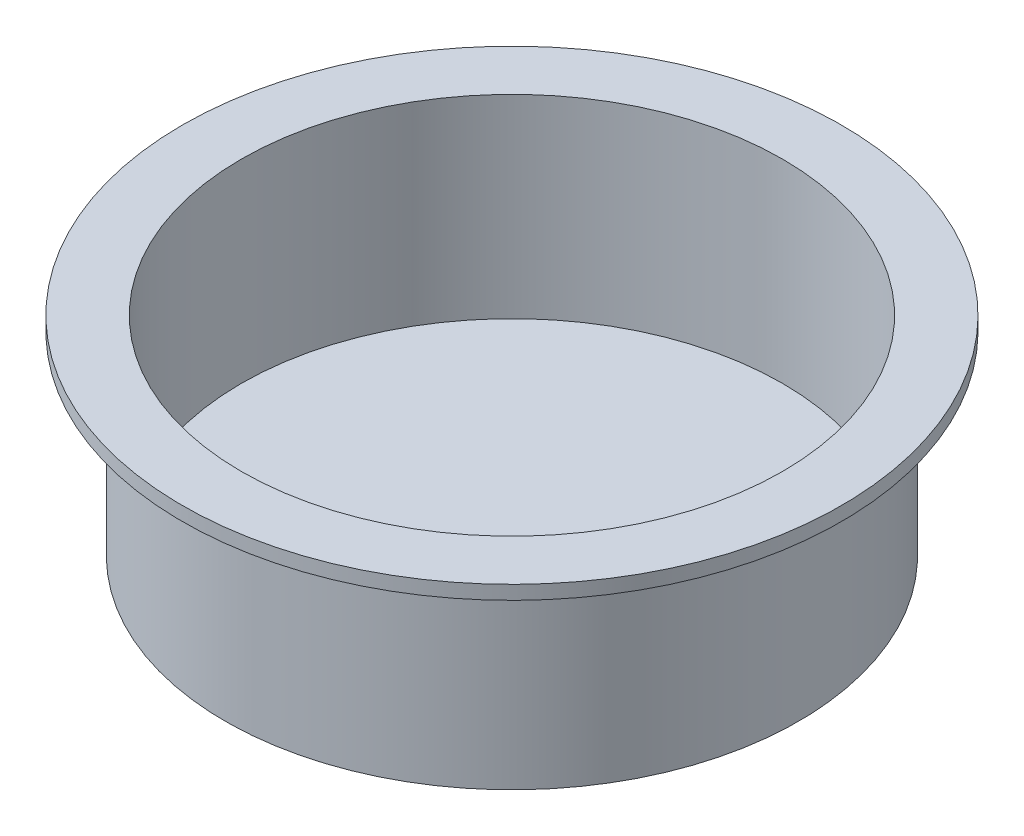
ISO-10303-21;
HEADER;
FILE_DESCRIPTION(('STEP AP214'),'2;1');
FILE_NAME('part.step','',(''),(''),'','','');
FILE_SCHEMA(('AUTOMOTIVE_DESIGN { 1 0 10303 214 1 1 1 1 }'));
ENDSEC;
DATA;
#1=APPLICATION_CONTEXT('core data for automotive mechanical design processes');
#2=APPLICATION_PROTOCOL_DEFINITION('international standard','automotive_design',2000,#1);
#3=PRODUCT_CONTEXT('',#1,'mechanical');
#4=PRODUCT('Part','Part','',(#3));
#5=PRODUCT_RELATED_PRODUCT_CATEGORY('part','',(#4));
#6=PRODUCT_DEFINITION_FORMATION('','',#4);
#7=PRODUCT_DEFINITION_CONTEXT('part definition',#1,'design');
#8=PRODUCT_DEFINITION('design','',#6,#7);
#9=PRODUCT_DEFINITION_SHAPE('','',#8);
#10=(LENGTH_UNIT() NAMED_UNIT(*) SI_UNIT(.MILLI.,.METRE.));
#11=(NAMED_UNIT(*) PLANE_ANGLE_UNIT() SI_UNIT($,.RADIAN.));
#12=(NAMED_UNIT(*) SI_UNIT($,.STERADIAN.) SOLID_ANGLE_UNIT());
#13=UNCERTAINTY_MEASURE_WITH_UNIT(LENGTH_MEASURE(1.E-05),#10,'distance_accuracy_value','');
#14=(GEOMETRIC_REPRESENTATION_CONTEXT(3) GLOBAL_UNCERTAINTY_ASSIGNED_CONTEXT((#13)) GLOBAL_UNIT_ASSIGNED_CONTEXT((#10,
#11,#12)) REPRESENTATION_CONTEXT('',''));
#15=CARTESIAN_POINT('',(0.,0.,0.));
#16=DIRECTION('',(0.,0.,1.));
#17=DIRECTION('',(1.,0.,0.));
#18=AXIS2_PLACEMENT_3D('',#15,#16,#17);
#19=CARTESIAN_POINT('',(0.,0.,0.));
#20=DIRECTION('',(0.,1.,0.));
#21=DIRECTION('',(-1.,0.,0.));
#22=AXIS2_PLACEMENT_3D('',#19,#20,#21);
#23=PLANE('',#22);
#24=CARTESIAN_POINT('',(0.,0.,0.));
#25=DIRECTION('',(0.,1.,0.));
#26=DIRECTION('',(-1.,0.,0.));
#27=AXIS2_PLACEMENT_3D('',#24,#25,#26);
#28=CIRCLE('',#27,26.2509);
#29=CARTESIAN_POINT('',(-26.2509,0.,0.));
#30=VERTEX_POINT('',#29);
#31=EDGE_CURVE('E10',#30,#30,#28,.T.);
#32=ORIENTED_EDGE('',*,*,#31,.F.);
#33=EDGE_LOOP('',(#32));
#34=FACE_BOUND('',#33,.T.);
#35=ADVANCED_FACE('F30',(#34),#23,.F.);
#36=CARTESIAN_POINT('',(0.,19.05,0.));
#37=DIRECTION('',(0.,1.,0.));
#38=DIRECTION('',(-1.,0.,0.));
#39=AXIS2_PLACEMENT_3D('',#36,#37,#38);
#40=CYLINDRICAL_SURFACE('',#39,26.2509);
#41=CARTESIAN_POINT('',(0.,17.78,0.));
#42=DIRECTION('',(0.,1.,0.));
#43=DIRECTION('',(-1.,0.,0.));
#44=AXIS2_PLACEMENT_3D('',#41,#42,#43);
#45=CIRCLE('',#44,26.2509);
#46=CARTESIAN_POINT('',(-26.2509,17.78,0.));
#47=VERTEX_POINT('',#46);
#48=EDGE_CURVE('E36',#47,#47,#45,.T.);
#49=ORIENTED_EDGE('',*,*,#48,.F.);
#50=EDGE_LOOP('',(#49));
#51=FACE_BOUND('',#50,.T.);
#52=ORIENTED_EDGE('',*,*,#31,.T.);
#53=EDGE_LOOP('',(#52));
#54=FACE_BOUND('',#53,.T.);
#55=ADVANCED_FACE('F78',(#51,#54),#40,.T.);
#56=CARTESIAN_POINT('',(26.2509,17.78,0.));
#57=DIRECTION('',(0.,1.,0.));
#58=DIRECTION('',(-1.,0.,0.));
#59=AXIS2_PLACEMENT_3D('',#56,#57,#58);
#60=PLANE('',#59);
#61=CARTESIAN_POINT('',(0.,17.78,0.));
#62=DIRECTION('',(0.,1.,0.));
#63=DIRECTION('',(-1.,0.,0.));
#64=AXIS2_PLACEMENT_3D('',#61,#62,#63);
#65=CIRCLE('',#64,30.1625);
#66=CARTESIAN_POINT('',(-30.1625,17.78,0.));
#67=VERTEX_POINT('',#66);
#68=EDGE_CURVE('E40',#67,#67,#65,.T.);
#69=ORIENTED_EDGE('',*,*,#68,.F.);
#70=EDGE_LOOP('',(#69));
#71=FACE_BOUND('',#70,.T.);
#72=ORIENTED_EDGE('',*,*,#48,.T.);
#73=EDGE_LOOP('',(#72));
#74=FACE_BOUND('',#73,.T.);
#75=ADVANCED_FACE('F73',(#71,#74),#60,.F.);
#76=CARTESIAN_POINT('',(0.,19.05,0.));
#77=DIRECTION('',(0.,1.,0.));
#78=DIRECTION('',(-1.,0.,0.));
#79=AXIS2_PLACEMENT_3D('',#76,#77,#78);
#80=CYLINDRICAL_SURFACE('',#79,30.1625);
#81=CARTESIAN_POINT('',(0.,19.05,0.));
#82=DIRECTION('',(0.,1.,0.));
#83=DIRECTION('',(-1.,0.,0.));
#84=AXIS2_PLACEMENT_3D('',#81,#82,#83);
#85=CIRCLE('',#84,30.1625);
#86=CARTESIAN_POINT('',(-30.1625,19.05,0.));
#87=VERTEX_POINT('',#86);
#88=EDGE_CURVE('E44',#87,#87,#85,.T.);
#89=ORIENTED_EDGE('',*,*,#88,.F.);
#90=EDGE_LOOP('',(#89));
#91=FACE_BOUND('',#90,.T.);
#92=ORIENTED_EDGE('',*,*,#68,.T.);
#93=EDGE_LOOP('',(#92));
#94=FACE_BOUND('',#93,.T.);
#95=ADVANCED_FACE('F67',(#91,#94),#80,.T.);
#96=CARTESIAN_POINT('',(30.1625,19.05,0.));
#97=DIRECTION('',(0.,-1.,0.));
#98=DIRECTION('',(1.,0.,0.));
#99=AXIS2_PLACEMENT_3D('',#96,#97,#98);
#100=PLANE('',#99);
#101=CARTESIAN_POINT('',(0.,19.05,0.));
#102=DIRECTION('',(0.,1.,0.));
#103=DIRECTION('',(-1.,0.,0.));
#104=AXIS2_PLACEMENT_3D('',#101,#102,#103);
#105=CIRCLE('',#104,24.765);
#106=CARTESIAN_POINT('',(-24.765,19.05,0.));
#107=VERTEX_POINT('',#106);
#108=EDGE_CURVE('E50',#107,#107,#105,.T.);
#109=ORIENTED_EDGE('',*,*,#108,.F.);
#110=EDGE_LOOP('',(#109));
#111=FACE_BOUND('',#110,.T.);
#112=ORIENTED_EDGE('',*,*,#88,.T.);
#113=EDGE_LOOP('',(#112));
#114=FACE_BOUND('',#113,.T.);
#115=ADVANCED_FACE('F61',(#111,#114),#100,.F.);
#116=CARTESIAN_POINT('',(0.,1.27000000000001,0.));
#117=DIRECTION('',(0.,1.,0.));
#118=DIRECTION('',(-1.,0.,0.));
#119=AXIS2_PLACEMENT_3D('',#116,#117,#118);
#120=CYLINDRICAL_SURFACE('',#119,24.765);
#121=CARTESIAN_POINT('',(0.,1.27000000000001,0.));
#122=DIRECTION('',(0.,1.,0.));
#123=DIRECTION('',(-1.,0.,0.));
#124=AXIS2_PLACEMENT_3D('',#121,#122,#123);
#125=CIRCLE('',#124,24.765);
#126=CARTESIAN_POINT('',(-24.765,1.27000000000001,0.));
#127=VERTEX_POINT('',#126);
#128=EDGE_CURVE('E49',#127,#127,#125,.T.);
#129=ORIENTED_EDGE('',*,*,#128,.F.);
#130=EDGE_LOOP('',(#129));
#131=FACE_BOUND('',#130,.T.);
#132=ORIENTED_EDGE('',*,*,#108,.T.);
#133=EDGE_LOOP('',(#132));
#134=FACE_BOUND('',#133,.T.);
#135=ADVANCED_FACE('F58',(#131,#134),#120,.F.);
#136=CARTESIAN_POINT('',(0.,1.27000000000001,0.));
#137=DIRECTION('',(0.,1.,0.));
#138=DIRECTION('',(-1.,0.,0.));
#139=AXIS2_PLACEMENT_3D('',#136,#137,#138);
#140=PLANE('',#139);
#141=ORIENTED_EDGE('',*,*,#128,.T.);
#142=EDGE_LOOP('',(#141));
#143=FACE_BOUND('',#142,.T.);
#144=ADVANCED_FACE('F56',(#143),#140,.T.);
#145=CLOSED_SHELL('',(#35,#55,#75,#95,#115,#135,#144));
#146=MANIFOLD_SOLID_BREP('B2',#145);
#147=ADVANCED_BREP_SHAPE_REPRESENTATION('',(#18,#146),#14);
#148=SHAPE_DEFINITION_REPRESENTATION(#9,#147);
ENDSEC;
END-ISO-10303-21;
